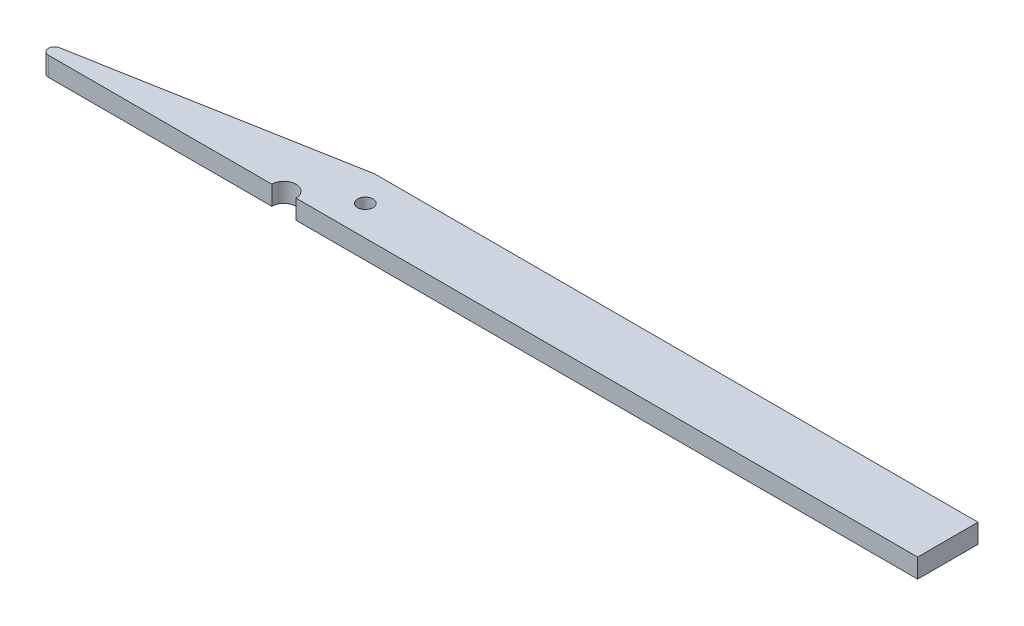
ISO-10303-21;
HEADER;
FILE_DESCRIPTION(('STEP AP214'),'2;1');
FILE_NAME('part.step','',(''),(''),'','','');
FILE_SCHEMA(('AUTOMOTIVE_DESIGN { 1 0 10303 214 1 1 1 1 }'));
ENDSEC;
DATA;
#1=APPLICATION_CONTEXT('core data for automotive mechanical design processes');
#2=APPLICATION_PROTOCOL_DEFINITION('international standard','automotive_design',2000,#1);
#3=PRODUCT_CONTEXT('',#1,'mechanical');
#4=PRODUCT('Part','Part','',(#3));
#5=PRODUCT_RELATED_PRODUCT_CATEGORY('part','',(#4));
#6=PRODUCT_DEFINITION_FORMATION('','',#4);
#7=PRODUCT_DEFINITION_CONTEXT('part definition',#1,'design');
#8=PRODUCT_DEFINITION('design','',#6,#7);
#9=PRODUCT_DEFINITION_SHAPE('','',#8);
#10=(LENGTH_UNIT() NAMED_UNIT(*) SI_UNIT(.MILLI.,.METRE.));
#11=(NAMED_UNIT(*) PLANE_ANGLE_UNIT() SI_UNIT($,.RADIAN.));
#12=(NAMED_UNIT(*) SI_UNIT($,.STERADIAN.) SOLID_ANGLE_UNIT());
#13=UNCERTAINTY_MEASURE_WITH_UNIT(LENGTH_MEASURE(1.E-05),#10,'distance_accuracy_value','');
#14=(GEOMETRIC_REPRESENTATION_CONTEXT(3) GLOBAL_UNCERTAINTY_ASSIGNED_CONTEXT((#13)) GLOBAL_UNIT_ASSIGNED_CONTEXT((#10,
#11,#12)) REPRESENTATION_CONTEXT('',''));
#15=CARTESIAN_POINT('',(0.,0.,0.));
#16=DIRECTION('',(0.,0.,1.));
#17=DIRECTION('',(1.,0.,0.));
#18=AXIS2_PLACEMENT_3D('',#15,#16,#17);
#19=CARTESIAN_POINT('',(0.,3.175,0.));
#20=DIRECTION('',(0.,0.,-1.));
#21=DIRECTION('',(-1.,0.,0.));
#22=AXIS2_PLACEMENT_3D('',#19,#20,#21);
#23=PLANE('',#22);
#24=DIRECTION('',(1.,0.,0.));
#25=VECTOR('',#24,1.);
#26=CARTESIAN_POINT('',(0.,0.,0.));
#27=LINE('',#26,#25);
#28=CARTESIAN_POINT('',(-224.004023854136,0.,0.));
#29=VERTEX_POINT('',#28);
#30=CARTESIAN_POINT('',(-187.,0.,0.));
#31=VERTEX_POINT('',#30);
#32=EDGE_CURVE('E115',#29,#31,#27,.T.);
#33=ORIENTED_EDGE('',*,*,#32,.T.);
#34=DIRECTION('',(0.,1.,0.));
#35=VECTOR('',#34,1.);
#36=CARTESIAN_POINT('',(-187.,0.,0.));
#37=LINE('',#36,#35);
#38=CARTESIAN_POINT('',(-187.,3.175,0.));
#39=VERTEX_POINT('',#38);
#40=EDGE_CURVE('E60',#31,#39,#37,.T.);
#41=ORIENTED_EDGE('',*,*,#40,.T.);
#42=DIRECTION('',(1.,0.,0.));
#43=VECTOR('',#42,1.);
#44=CARTESIAN_POINT('',(0.,3.175,0.));
#45=LINE('',#44,#43);
#46=CARTESIAN_POINT('',(-224.004023854136,3.175,0.));
#47=VERTEX_POINT('',#46);
#48=EDGE_CURVE('E127',#47,#39,#45,.T.);
#49=ORIENTED_EDGE('',*,*,#48,.F.);
#50=DIRECTION('',(0.,-1.,0.));
#51=VECTOR('',#50,1.);
#52=CARTESIAN_POINT('',(-224.004023854136,3.175,0.));
#53=LINE('',#52,#51);
#54=EDGE_CURVE('E130',#47,#29,#53,.T.);
#55=ORIENTED_EDGE('',*,*,#54,.T.);
#56=EDGE_LOOP('',(#33,#41,#49,#55));
#57=FACE_BOUND('',#56,.T.);
#58=ADVANCED_FACE('F37',(#57),#23,.F.);
#59=CARTESIAN_POINT('',(-180.,3.175,-10.));
#60=DIRECTION('',(0.,0.,1.));
#61=DIRECTION('',(1.,0.,0.));
#62=AXIS2_PLACEMENT_3D('',#59,#60,#61);
#63=PLANE('',#62);
#64=DIRECTION('',(-1.,0.,0.));
#65=VECTOR('',#64,1.);
#66=CARTESIAN_POINT('',(-180.,3.175,-10.));
#67=LINE('',#66,#65);
#68=CARTESIAN_POINT('',(-80.,3.175,-10.));
#69=VERTEX_POINT('',#68);
#70=CARTESIAN_POINT('',(-180.,3.175,-10.));
#71=VERTEX_POINT('',#70);
#72=EDGE_CURVE('E107',#69,#71,#67,.T.);
#73=ORIENTED_EDGE('',*,*,#72,.F.);
#74=DIRECTION('',(0.,-1.,0.));
#75=VECTOR('',#74,1.);
#76=CARTESIAN_POINT('',(-80.,3.175,-10.));
#77=LINE('',#76,#75);
#78=CARTESIAN_POINT('',(-80.,0.,-10.));
#79=VERTEX_POINT('',#78);
#80=EDGE_CURVE('E94',#69,#79,#77,.T.);
#81=ORIENTED_EDGE('',*,*,#80,.T.);
#82=DIRECTION('',(-1.,0.,0.));
#83=VECTOR('',#82,1.);
#84=CARTESIAN_POINT('',(-180.,0.,-10.));
#85=LINE('',#84,#83);
#86=CARTESIAN_POINT('',(-180.,0.,-10.));
#87=VERTEX_POINT('',#86);
#88=EDGE_CURVE('E131',#79,#87,#85,.T.);
#89=ORIENTED_EDGE('',*,*,#88,.T.);
#90=DIRECTION('',(0.,-1.,0.));
#91=VECTOR('',#90,1.);
#92=CARTESIAN_POINT('',(-180.,3.175,-10.));
#93=LINE('',#92,#91);
#94=EDGE_CURVE('E11',#71,#87,#93,.T.);
#95=ORIENTED_EDGE('',*,*,#94,.F.);
#96=EDGE_LOOP('',(#73,#81,#89,#95));
#97=FACE_BOUND('',#96,.T.);
#98=ADVANCED_FACE('F39',(#97),#63,.F.);
#99=CARTESIAN_POINT('',(-180.,3.175,-10.));
#100=DIRECTION('',(0.178516235751104,0.,0.983936966260164));
#101=DIRECTION('',(0.983936966260165,0.,-0.178516235751104));
#102=AXIS2_PLACEMENT_3D('',#99,#100,#101);
#103=PLANE('',#102);
#104=DIRECTION('',(-0.983936966260164,0.,0.178516235751104));
#105=VECTOR('',#104,1.);
#106=CARTESIAN_POINT('',(-180.,0.,-10.));
#107=LINE('',#106,#105);
#108=CARTESIAN_POINT('',(-224.182540089887,0.,-1.98393696625943));
#109=VERTEX_POINT('',#108);
#110=EDGE_CURVE('E133',#87,#109,#107,.T.);
#111=ORIENTED_EDGE('',*,*,#110,.T.);
#112=DIRECTION('',(0.,-1.,0.));
#113=VECTOR('',#112,1.);
#114=CARTESIAN_POINT('',(-224.182540089887,3.175,-1.98393696625943));
#115=LINE('',#114,#113);
#116=CARTESIAN_POINT('',(-224.182540089887,3.175,-1.98393696625943));
#117=VERTEX_POINT('',#116);
#118=EDGE_CURVE('E45',#117,#109,#115,.T.);
#119=ORIENTED_EDGE('',*,*,#118,.F.);
#120=DIRECTION('',(-0.983936966260164,0.,0.178516235751104));
#121=VECTOR('',#120,1.);
#122=CARTESIAN_POINT('',(-180.,3.175,-10.));
#123=LINE('',#122,#121);
#124=EDGE_CURVE('E114',#71,#117,#123,.T.);
#125=ORIENTED_EDGE('',*,*,#124,.F.);
#126=ORIENTED_EDGE('',*,*,#94,.T.);
#127=EDGE_LOOP('',(#111,#119,#125,#126));
#128=FACE_BOUND('',#127,.T.);
#129=ADVANCED_FACE('F155',(#128),#103,.F.);
#130=CARTESIAN_POINT('',(-224.004023854136,3.175,-0.999999999999594));
#131=DIRECTION('',(0.,-1.,0.));
#132=DIRECTION('',(0.,0.,-1.));
#133=AXIS2_PLACEMENT_3D('',#130,#131,#132);
#134=CYLINDRICAL_SURFACE('',#133,0.999999999999662);
#135=CARTESIAN_POINT('',(-224.004023854136,0.,-0.999999999999594));
#136=DIRECTION('',(0.,1.,0.));
#137=DIRECTION('',(0.,0.,-1.));
#138=AXIS2_PLACEMENT_3D('',#135,#136,#137);
#139=CIRCLE('',#138,0.999999999999662);
#140=EDGE_CURVE('E135',#109,#29,#139,.T.);
#141=ORIENTED_EDGE('',*,*,#140,.T.);
#142=ORIENTED_EDGE('',*,*,#54,.F.);
#143=CARTESIAN_POINT('',(-224.004023854136,3.175,-0.999999999999594));
#144=DIRECTION('',(0.,1.,0.));
#145=DIRECTION('',(0.,0.,-1.));
#146=AXIS2_PLACEMENT_3D('',#143,#144,#145);
#147=CIRCLE('',#146,0.999999999999662);
#148=EDGE_CURVE('E117',#117,#47,#147,.T.);
#149=ORIENTED_EDGE('',*,*,#148,.F.);
#150=ORIENTED_EDGE('',*,*,#118,.T.);
#151=EDGE_LOOP('',(#141,#142,#149,#150));
#152=FACE_BOUND('',#151,.T.);
#153=ADVANCED_FACE('F143',(#152),#134,.T.);
#154=CARTESIAN_POINT('',(-183.,0.,0.));
#155=VERTEX_POINT('',#154);
#156=CARTESIAN_POINT('',(-80.,0.,0.));
#157=VERTEX_POINT('',#156);
#158=EDGE_CURVE('E120',#155,#157,#27,.T.);
#159=ORIENTED_EDGE('',*,*,#158,.T.);
#160=DIRECTION('',(0.,-1.,0.));
#161=VECTOR('',#160,1.);
#162=CARTESIAN_POINT('',(-80.,3.175,0.));
#163=LINE('',#162,#161);
#164=CARTESIAN_POINT('',(-80.,3.175,0.));
#165=VERTEX_POINT('',#164);
#166=EDGE_CURVE('E52',#165,#157,#163,.T.);
#167=ORIENTED_EDGE('',*,*,#166,.F.);
#168=CARTESIAN_POINT('',(-183.,3.175,0.));
#169=VERTEX_POINT('',#168);
#170=EDGE_CURVE('E111',#169,#165,#45,.T.);
#171=ORIENTED_EDGE('',*,*,#170,.F.);
#172=DIRECTION('',(0.,1.,0.));
#173=VECTOR('',#172,1.);
#174=CARTESIAN_POINT('',(-183.,0.,0.));
#175=LINE('',#174,#173);
#176=EDGE_CURVE('E176',#155,#169,#175,.T.);
#177=ORIENTED_EDGE('',*,*,#176,.F.);
#178=EDGE_LOOP('',(#159,#167,#171,#177));
#179=FACE_BOUND('',#178,.T.);
#180=ADVANCED_FACE('F161',(#179),#23,.F.);
#181=CARTESIAN_POINT('',(0.,3.175,-5.));
#182=DIRECTION('',(0.,1.,0.));
#183=DIRECTION('',(0.,0.,1.));
#184=AXIS2_PLACEMENT_3D('',#181,#182,#183);
#185=PLANE('',#184);
#186=DIRECTION('',(0.,0.,-1.));
#187=VECTOR('',#186,1.);
#188=CARTESIAN_POINT('',(-80.,3.175,0.));
#189=LINE('',#188,#187);
#190=EDGE_CURVE('E97',#165,#69,#189,.T.);
#191=ORIENTED_EDGE('',*,*,#190,.T.);
#192=ORIENTED_EDGE('',*,*,#72,.T.);
#193=ORIENTED_EDGE('',*,*,#124,.T.);
#194=ORIENTED_EDGE('',*,*,#148,.T.);
#195=ORIENTED_EDGE('',*,*,#48,.T.);
#196=CARTESIAN_POINT('',(-185.,3.175,0.));
#197=DIRECTION('',(0.,1.,0.));
#198=DIRECTION('',(0.,0.,-1.));
#199=AXIS2_PLACEMENT_3D('',#196,#197,#198);
#200=CIRCLE('',#199,2.);
#201=EDGE_CURVE('E154',#169,#39,#200,.T.);
#202=ORIENTED_EDGE('',*,*,#201,.F.);
#203=ORIENTED_EDGE('',*,*,#170,.T.);
#204=EDGE_LOOP('',(#191,#192,#193,#194,#195,#202,#203));
#205=FACE_BOUND('',#204,.T.);
#206=CARTESIAN_POINT('',(-176.52,3.175,-5.));
#207=DIRECTION('',(0.,1.,0.));
#208=DIRECTION('',(0.,0.,1.));
#209=AXIS2_PLACEMENT_3D('',#206,#207,#208);
#210=CIRCLE('',#209,1.27);
#211=CARTESIAN_POINT('',(-176.52,3.175,-3.72999999999999));
#212=VERTEX_POINT('',#211);
#213=EDGE_CURVE('E123',#212,#212,#210,.T.);
#214=ORIENTED_EDGE('',*,*,#213,.F.);
#215=EDGE_LOOP('',(#214));
#216=FACE_BOUND('',#215,.T.);
#217=ADVANCED_FACE('F105',(#205,#216),#185,.T.);
#218=CARTESIAN_POINT('',(0.,0.,-5.));
#219=DIRECTION('',(0.,1.,0.));
#220=DIRECTION('',(0.,0.,1.));
#221=AXIS2_PLACEMENT_3D('',#218,#219,#220);
#222=PLANE('',#221);
#223=CARTESIAN_POINT('',(-176.52,0.,-5.));
#224=DIRECTION('',(0.,1.,0.));
#225=DIRECTION('',(0.,0.,1.));
#226=AXIS2_PLACEMENT_3D('',#223,#224,#225);
#227=CIRCLE('',#226,1.27);
#228=CARTESIAN_POINT('',(-176.52,0.,-3.72999999999999));
#229=VERTEX_POINT('',#228);
#230=EDGE_CURVE('E183',#229,#229,#227,.F.);
#231=ORIENTED_EDGE('',*,*,#230,.F.);
#232=EDGE_LOOP('',(#231));
#233=FACE_BOUND('',#232,.T.);
#234=ORIENTED_EDGE('',*,*,#88,.F.);
#235=DIRECTION('',(0.,0.,-1.));
#236=VECTOR('',#235,1.);
#237=CARTESIAN_POINT('',(-80.,0.,0.));
#238=LINE('',#237,#236);
#239=EDGE_CURVE('E98',#157,#79,#238,.T.);
#240=ORIENTED_EDGE('',*,*,#239,.F.);
#241=ORIENTED_EDGE('',*,*,#158,.F.);
#242=CARTESIAN_POINT('',(-185.,0.,0.));
#243=DIRECTION('',(0.,1.,0.));
#244=DIRECTION('',(0.,0.,-1.));
#245=AXIS2_PLACEMENT_3D('',#242,#243,#244);
#246=CIRCLE('',#245,2.);
#247=EDGE_CURVE('E151',#155,#31,#246,.T.);
#248=ORIENTED_EDGE('',*,*,#247,.T.);
#249=ORIENTED_EDGE('',*,*,#32,.F.);
#250=ORIENTED_EDGE('',*,*,#140,.F.);
#251=ORIENTED_EDGE('',*,*,#110,.F.);
#252=EDGE_LOOP('',(#234,#240,#241,#248,#249,#250,#251));
#253=FACE_BOUND('',#252,.T.);
#254=ADVANCED_FACE('F149',(#233,#253),#222,.F.);
#255=CARTESIAN_POINT('',(-176.52,-0.00100000000000013,-5.));
#256=DIRECTION('',(0.,1.,0.));
#257=DIRECTION('',(0.,0.,1.));
#258=AXIS2_PLACEMENT_3D('',#255,#256,#257);
#259=CYLINDRICAL_SURFACE('',#258,1.27);
#260=ORIENTED_EDGE('',*,*,#213,.T.);
#261=EDGE_LOOP('',(#260));
#262=FACE_BOUND('',#261,.T.);
#263=ORIENTED_EDGE('',*,*,#230,.T.);
#264=EDGE_LOOP('',(#263));
#265=FACE_BOUND('',#264,.T.);
#266=ADVANCED_FACE('F190',(#262,#265),#259,.F.);
#267=CARTESIAN_POINT('',(-185.,0.,0.));
#268=DIRECTION('',(0.,1.,0.));
#269=DIRECTION('',(0.,0.,1.));
#270=AXIS2_PLACEMENT_3D('',#267,#268,#269);
#271=CYLINDRICAL_SURFACE('',#270,2.);
#272=ORIENTED_EDGE('',*,*,#201,.T.);
#273=ORIENTED_EDGE('',*,*,#40,.F.);
#274=ORIENTED_EDGE('',*,*,#247,.F.);
#275=ORIENTED_EDGE('',*,*,#176,.T.);
#276=EDGE_LOOP('',(#272,#273,#274,#275));
#277=FACE_BOUND('',#276,.T.);
#278=ADVANCED_FACE('F192',(#277),#271,.F.);
#279=CARTESIAN_POINT('',(-80.,3.175,0.));
#280=DIRECTION('',(-1.,0.,0.));
#281=DIRECTION('',(0.,0.,1.));
#282=AXIS2_PLACEMENT_3D('',#279,#280,#281);
#283=PLANE('',#282);
#284=ORIENTED_EDGE('',*,*,#239,.T.);
#285=ORIENTED_EDGE('',*,*,#80,.F.);
#286=ORIENTED_EDGE('',*,*,#190,.F.);
#287=ORIENTED_EDGE('',*,*,#166,.T.);
#288=EDGE_LOOP('',(#284,#285,#286,#287));
#289=FACE_BOUND('',#288,.T.);
#290=ADVANCED_FACE('F96',(#289),#283,.F.);
#291=CLOSED_SHELL('',(#58,#98,#129,#153,#180,#217,#254,#266,#278,#290));
#292=MANIFOLD_SOLID_BREP('B2',#291);
#293=ADVANCED_BREP_SHAPE_REPRESENTATION('',(#18,#292),#14);
#294=SHAPE_DEFINITION_REPRESENTATION(#9,#293);
ENDSEC;
END-ISO-10303-21;
